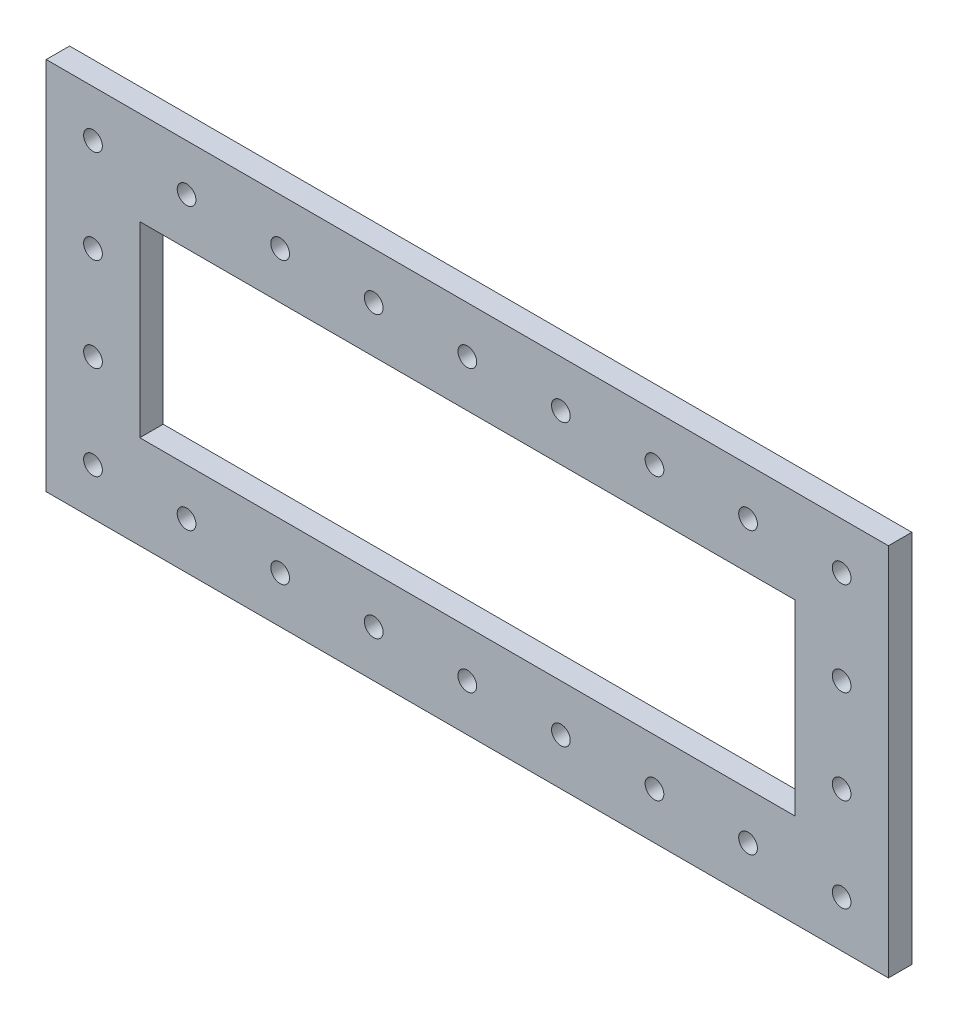
ISO-10303-21;
HEADER;
FILE_DESCRIPTION(('STEP AP214'),'2;1');
FILE_NAME('part.step','',(''),(''),'','','');
FILE_SCHEMA(('AUTOMOTIVE_DESIGN { 1 0 10303 214 1 1 1 1 }'));
ENDSEC;
DATA;
#1=APPLICATION_CONTEXT('core data for automotive mechanical design processes');
#2=APPLICATION_PROTOCOL_DEFINITION('international standard','automotive_design',2000,#1);
#3=PRODUCT_CONTEXT('',#1,'mechanical');
#4=PRODUCT('Part','Part','',(#3));
#5=PRODUCT_RELATED_PRODUCT_CATEGORY('part','',(#4));
#6=PRODUCT_DEFINITION_FORMATION('','',#4);
#7=PRODUCT_DEFINITION_CONTEXT('part definition',#1,'design');
#8=PRODUCT_DEFINITION('design','',#6,#7);
#9=PRODUCT_DEFINITION_SHAPE('','',#8);
#10=(LENGTH_UNIT() NAMED_UNIT(*) SI_UNIT(.MILLI.,.METRE.));
#11=(NAMED_UNIT(*) PLANE_ANGLE_UNIT() SI_UNIT($,.RADIAN.));
#12=(NAMED_UNIT(*) SI_UNIT($,.STERADIAN.) SOLID_ANGLE_UNIT());
#13=UNCERTAINTY_MEASURE_WITH_UNIT(LENGTH_MEASURE(1.E-05),#10,'distance_accuracy_value','');
#14=(GEOMETRIC_REPRESENTATION_CONTEXT(3) GLOBAL_UNCERTAINTY_ASSIGNED_CONTEXT((#13)) GLOBAL_UNIT_ASSIGNED_CONTEXT((#10,
#11,#12)) REPRESENTATION_CONTEXT('',''));
#15=CARTESIAN_POINT('',(0.,0.,0.));
#16=DIRECTION('',(0.,0.,1.));
#17=DIRECTION('',(1.,0.,0.));
#18=AXIS2_PLACEMENT_3D('',#15,#16,#17);
#19=CARTESIAN_POINT('',(228.6,0.,6.35));
#20=DIRECTION('',(0.,1.,0.));
#21=DIRECTION('',(-1.,0.,0.));
#22=AXIS2_PLACEMENT_3D('',#19,#20,#21);
#23=PLANE('',#22);
#24=DIRECTION('',(1.,0.,0.));
#25=VECTOR('',#24,1.);
#26=CARTESIAN_POINT('',(228.6,0.,0.));
#27=LINE('',#26,#25);
#28=CARTESIAN_POINT('',(0.,0.,0.));
#29=VERTEX_POINT('',#28);
#30=CARTESIAN_POINT('',(228.6,0.,0.));
#31=VERTEX_POINT('',#30);
#32=EDGE_CURVE('E210',#29,#31,#27,.T.);
#33=ORIENTED_EDGE('',*,*,#32,.T.);
#34=DIRECTION('',(0.,0.,-1.));
#35=VECTOR('',#34,1.);
#36=CARTESIAN_POINT('',(228.6,0.,6.35));
#37=LINE('',#36,#35);
#38=CARTESIAN_POINT('',(228.6,0.,6.35));
#39=VERTEX_POINT('',#38);
#40=EDGE_CURVE('E11',#39,#31,#37,.T.);
#41=ORIENTED_EDGE('',*,*,#40,.F.);
#42=DIRECTION('',(1.,0.,0.));
#43=VECTOR('',#42,1.);
#44=CARTESIAN_POINT('',(228.6,0.,6.35));
#45=LINE('',#44,#43);
#46=CARTESIAN_POINT('',(0.,0.,6.35));
#47=VERTEX_POINT('',#46);
#48=EDGE_CURVE('E213',#47,#39,#45,.T.);
#49=ORIENTED_EDGE('',*,*,#48,.F.);
#50=DIRECTION('',(0.,0.,-1.));
#51=VECTOR('',#50,1.);
#52=CARTESIAN_POINT('',(0.,0.,6.35));
#53=LINE('',#52,#51);
#54=EDGE_CURVE('E111',#47,#29,#53,.T.);
#55=ORIENTED_EDGE('',*,*,#54,.T.);
#56=EDGE_LOOP('',(#33,#41,#49,#55));
#57=FACE_BOUND('',#56,.T.);
#58=ADVANCED_FACE('F36',(#57),#23,.F.);
#59=CARTESIAN_POINT('',(228.6,50.8,6.35));
#60=DIRECTION('',(-1.,0.,0.));
#61=DIRECTION('',(0.,0.,1.));
#62=AXIS2_PLACEMENT_3D('',#59,#60,#61);
#63=PLANE('',#62);
#64=DIRECTION('',(0.,1.,0.));
#65=VECTOR('',#64,1.);
#66=CARTESIAN_POINT('',(228.6,50.8,0.));
#67=LINE('',#66,#65);
#68=CARTESIAN_POINT('',(228.6,101.6,0.));
#69=VERTEX_POINT('',#68);
#70=EDGE_CURVE('E223',#31,#69,#67,.T.);
#71=ORIENTED_EDGE('',*,*,#70,.T.);
#72=DIRECTION('',(0.,0.,-1.));
#73=VECTOR('',#72,1.);
#74=CARTESIAN_POINT('',(228.6,101.6,6.35));
#75=LINE('',#74,#73);
#76=CARTESIAN_POINT('',(228.6,101.6,6.35));
#77=VERTEX_POINT('',#76);
#78=EDGE_CURVE('E131',#77,#69,#75,.T.);
#79=ORIENTED_EDGE('',*,*,#78,.F.);
#80=DIRECTION('',(0.,1.,0.));
#81=VECTOR('',#80,1.);
#82=CARTESIAN_POINT('',(228.6,50.8,6.35));
#83=LINE('',#82,#81);
#84=EDGE_CURVE('E85',#39,#77,#83,.T.);
#85=ORIENTED_EDGE('',*,*,#84,.F.);
#86=ORIENTED_EDGE('',*,*,#40,.T.);
#87=EDGE_LOOP('',(#71,#79,#85,#86));
#88=FACE_BOUND('',#87,.T.);
#89=ADVANCED_FACE('F252',(#88),#63,.F.);
#90=CARTESIAN_POINT('',(203.2,25.4,6.35));
#91=DIRECTION('',(1.,0.,0.));
#92=DIRECTION('',(0.,0.,-1.));
#93=AXIS2_PLACEMENT_3D('',#90,#91,#92);
#94=PLANE('',#93);
#95=DIRECTION('',(0.,-1.,0.));
#96=VECTOR('',#95,1.);
#97=CARTESIAN_POINT('',(203.2,25.4,0.));
#98=LINE('',#97,#96);
#99=CARTESIAN_POINT('',(203.2,76.2,0.));
#100=VERTEX_POINT('',#99);
#101=CARTESIAN_POINT('',(203.2,25.4,0.));
#102=VERTEX_POINT('',#101);
#103=EDGE_CURVE('E225',#100,#102,#98,.T.);
#104=ORIENTED_EDGE('',*,*,#103,.T.);
#105=DIRECTION('',(0.,0.,-1.));
#106=VECTOR('',#105,1.);
#107=CARTESIAN_POINT('',(203.2,25.4,6.35));
#108=LINE('',#107,#106);
#109=CARTESIAN_POINT('',(203.2,25.4,6.35));
#110=VERTEX_POINT('',#109);
#111=EDGE_CURVE('E44',#110,#102,#108,.T.);
#112=ORIENTED_EDGE('',*,*,#111,.F.);
#113=DIRECTION('',(0.,-1.,0.));
#114=VECTOR('',#113,1.);
#115=CARTESIAN_POINT('',(203.2,25.4,6.35));
#116=LINE('',#115,#114);
#117=CARTESIAN_POINT('',(203.2,76.2,6.35));
#118=VERTEX_POINT('',#117);
#119=EDGE_CURVE('E216',#118,#110,#116,.T.);
#120=ORIENTED_EDGE('',*,*,#119,.F.);
#121=DIRECTION('',(0.,0.,-1.));
#122=VECTOR('',#121,1.);
#123=CARTESIAN_POINT('',(203.2,76.2,6.35));
#124=LINE('',#123,#122);
#125=EDGE_CURVE('E142',#118,#100,#124,.T.);
#126=ORIENTED_EDGE('',*,*,#125,.T.);
#127=EDGE_LOOP('',(#104,#112,#120,#126));
#128=FACE_BOUND('',#127,.T.);
#129=ADVANCED_FACE('F250',(#128),#94,.F.);
#130=CARTESIAN_POINT('',(25.4,25.4,6.35));
#131=DIRECTION('',(0.,-1.,0.));
#132=DIRECTION('',(0.,0.,-1.));
#133=AXIS2_PLACEMENT_3D('',#130,#131,#132);
#134=PLANE('',#133);
#135=DIRECTION('',(-1.,0.,0.));
#136=VECTOR('',#135,1.);
#137=CARTESIAN_POINT('',(25.4,25.4,0.));
#138=LINE('',#137,#136);
#139=CARTESIAN_POINT('',(25.4,25.4,0.));
#140=VERTEX_POINT('',#139);
#141=EDGE_CURVE('E71',#102,#140,#138,.T.);
#142=ORIENTED_EDGE('',*,*,#141,.T.);
#143=DIRECTION('',(0.,0.,-1.));
#144=VECTOR('',#143,1.);
#145=CARTESIAN_POINT('',(25.4,25.4,6.35));
#146=LINE('',#145,#144);
#147=CARTESIAN_POINT('',(25.4,25.4,6.35));
#148=VERTEX_POINT('',#147);
#149=EDGE_CURVE('E232',#148,#140,#146,.T.);
#150=ORIENTED_EDGE('',*,*,#149,.F.);
#151=DIRECTION('',(-1.,0.,0.));
#152=VECTOR('',#151,1.);
#153=CARTESIAN_POINT('',(25.4,25.4,6.35));
#154=LINE('',#153,#152);
#155=EDGE_CURVE('E218',#110,#148,#154,.T.);
#156=ORIENTED_EDGE('',*,*,#155,.F.);
#157=ORIENTED_EDGE('',*,*,#111,.T.);
#158=EDGE_LOOP('',(#142,#150,#156,#157));
#159=FACE_BOUND('',#158,.T.);
#160=ADVANCED_FACE('F235',(#159),#134,.F.);
#161=CARTESIAN_POINT('',(25.4,50.8,6.35));
#162=DIRECTION('',(-1.,0.,0.));
#163=DIRECTION('',(0.,-1.,0.));
#164=AXIS2_PLACEMENT_3D('',#161,#162,#163);
#165=PLANE('',#164);
#166=DIRECTION('',(0.,1.,0.));
#167=VECTOR('',#166,1.);
#168=CARTESIAN_POINT('',(25.4,50.8,0.));
#169=LINE('',#168,#167);
#170=CARTESIAN_POINT('',(25.4,76.2,0.));
#171=VERTEX_POINT('',#170);
#172=EDGE_CURVE('E228',#140,#171,#169,.T.);
#173=ORIENTED_EDGE('',*,*,#172,.T.);
#174=DIRECTION('',(0.,0.,-1.));
#175=VECTOR('',#174,1.);
#176=CARTESIAN_POINT('',(25.4,76.2,6.35));
#177=LINE('',#176,#175);
#178=CARTESIAN_POINT('',(25.4,76.2,6.35));
#179=VERTEX_POINT('',#178);
#180=EDGE_CURVE('E123',#179,#171,#177,.T.);
#181=ORIENTED_EDGE('',*,*,#180,.F.);
#182=DIRECTION('',(0.,1.,0.));
#183=VECTOR('',#182,1.);
#184=CARTESIAN_POINT('',(25.4,50.8,6.35));
#185=LINE('',#184,#183);
#186=EDGE_CURVE('E113',#148,#179,#185,.T.);
#187=ORIENTED_EDGE('',*,*,#186,.F.);
#188=ORIENTED_EDGE('',*,*,#149,.T.);
#189=EDGE_LOOP('',(#173,#181,#187,#188));
#190=FACE_BOUND('',#189,.T.);
#191=ADVANCED_FACE('F243',(#190),#165,.F.);
#192=CARTESIAN_POINT('',(0.,0.,6.35));
#193=DIRECTION('',(1.,0.,0.));
#194=DIRECTION('',(0.,0.,-1.));
#195=AXIS2_PLACEMENT_3D('',#192,#193,#194);
#196=PLANE('',#195);
#197=DIRECTION('',(0.,-1.,0.));
#198=VECTOR('',#197,1.);
#199=CARTESIAN_POINT('',(0.,0.,0.));
#200=LINE('',#199,#198);
#201=CARTESIAN_POINT('',(0.,101.6,0.));
#202=VERTEX_POINT('',#201);
#203=EDGE_CURVE('E78',#202,#29,#200,.T.);
#204=ORIENTED_EDGE('',*,*,#203,.T.);
#205=ORIENTED_EDGE('',*,*,#54,.F.);
#206=DIRECTION('',(0.,-1.,0.));
#207=VECTOR('',#206,1.);
#208=CARTESIAN_POINT('',(0.,0.,6.35));
#209=LINE('',#208,#207);
#210=CARTESIAN_POINT('',(0.,101.6,6.35));
#211=VERTEX_POINT('',#210);
#212=EDGE_CURVE('E52',#211,#47,#209,.T.);
#213=ORIENTED_EDGE('',*,*,#212,.F.);
#214=DIRECTION('',(0.,0.,-1.));
#215=VECTOR('',#214,1.);
#216=CARTESIAN_POINT('',(0.,101.6,6.35));
#217=LINE('',#216,#215);
#218=EDGE_CURVE('E109',#211,#202,#217,.T.);
#219=ORIENTED_EDGE('',*,*,#218,.T.);
#220=EDGE_LOOP('',(#204,#205,#213,#219));
#221=FACE_BOUND('',#220,.T.);
#222=ADVANCED_FACE('F108',(#221),#196,.F.);
#223=CARTESIAN_POINT('',(0.,0.,6.35));
#224=DIRECTION('',(0.,0.,-1.));
#225=DIRECTION('',(-1.,0.,0.));
#226=AXIS2_PLACEMENT_3D('',#223,#224,#225);
#227=PLANE('',#226);
#228=CARTESIAN_POINT('',(215.9,63.5000000000001,6.35));
#229=DIRECTION('',(0.,0.,-1.));
#230=DIRECTION('',(-1.,0.,0.));
#231=AXIS2_PLACEMENT_3D('',#228,#229,#230);
#232=CIRCLE('',#231,2.53999999999996);
#233=CARTESIAN_POINT('',(213.36,63.5000000000001,6.35));
#234=VERTEX_POINT('',#233);
#235=EDGE_CURVE('E635',#234,#234,#232,.T.);
#236=ORIENTED_EDGE('',*,*,#235,.T.);
#237=EDGE_LOOP('',(#236));
#238=FACE_BOUND('',#237,.T.);
#239=CARTESIAN_POINT('',(215.9,88.9,6.35));
#240=DIRECTION('',(0.,0.,-1.));
#241=DIRECTION('',(1.,0.,0.));
#242=AXIS2_PLACEMENT_3D('',#239,#240,#241);
#243=CIRCLE('',#242,2.54000000000001);
#244=CARTESIAN_POINT('',(218.44,88.9,6.35));
#245=VERTEX_POINT('',#244);
#246=EDGE_CURVE('E637',#245,#245,#243,.T.);
#247=ORIENTED_EDGE('',*,*,#246,.T.);
#248=EDGE_LOOP('',(#247));
#249=FACE_BOUND('',#248,.T.);
#250=CARTESIAN_POINT('',(190.5,88.9,6.35));
#251=DIRECTION('',(0.,0.,-1.));
#252=DIRECTION('',(1.,0.,0.));
#253=AXIS2_PLACEMENT_3D('',#250,#251,#252);
#254=CIRCLE('',#253,2.53999999999998);
#255=CARTESIAN_POINT('',(193.04,88.9,6.35));
#256=VERTEX_POINT('',#255);
#257=EDGE_CURVE('E692',#256,#256,#254,.T.);
#258=ORIENTED_EDGE('',*,*,#257,.T.);
#259=EDGE_LOOP('',(#258));
#260=FACE_BOUND('',#259,.T.);
#261=CARTESIAN_POINT('',(165.1,88.9,6.35));
#262=DIRECTION('',(0.,0.,-1.));
#263=DIRECTION('',(1.,0.,0.));
#264=AXIS2_PLACEMENT_3D('',#261,#262,#263);
#265=CIRCLE('',#264,2.54000000000001);
#266=CARTESIAN_POINT('',(167.64,88.9,6.35));
#267=VERTEX_POINT('',#266);
#268=EDGE_CURVE('E686',#267,#267,#265,.T.);
#269=ORIENTED_EDGE('',*,*,#268,.T.);
#270=EDGE_LOOP('',(#269));
#271=FACE_BOUND('',#270,.T.);
#272=CARTESIAN_POINT('',(139.7,88.9,6.35));
#273=DIRECTION('',(0.,0.,-1.));
#274=DIRECTION('',(1.,0.,0.));
#275=AXIS2_PLACEMENT_3D('',#272,#273,#274);
#276=CIRCLE('',#275,2.54000000000001);
#277=CARTESIAN_POINT('',(142.24,88.9,6.35));
#278=VERTEX_POINT('',#277);
#279=EDGE_CURVE('E680',#278,#278,#276,.T.);
#280=ORIENTED_EDGE('',*,*,#279,.T.);
#281=EDGE_LOOP('',(#280));
#282=FACE_BOUND('',#281,.T.);
#283=CARTESIAN_POINT('',(114.3,88.9,6.35));
#284=DIRECTION('',(0.,0.,-1.));
#285=DIRECTION('',(1.,0.,0.));
#286=AXIS2_PLACEMENT_3D('',#283,#284,#285);
#287=CIRCLE('',#286,2.54);
#288=CARTESIAN_POINT('',(116.84,88.9,6.35));
#289=VERTEX_POINT('',#288);
#290=EDGE_CURVE('E674',#289,#289,#287,.T.);
#291=ORIENTED_EDGE('',*,*,#290,.T.);
#292=EDGE_LOOP('',(#291));
#293=FACE_BOUND('',#292,.T.);
#294=CARTESIAN_POINT('',(88.9,88.9,6.35));
#295=DIRECTION('',(0.,0.,-1.));
#296=DIRECTION('',(1.,0.,0.));
#297=AXIS2_PLACEMENT_3D('',#294,#295,#296);
#298=CIRCLE('',#297,2.54);
#299=CARTESIAN_POINT('',(91.44,88.9,6.35));
#300=VERTEX_POINT('',#299);
#301=EDGE_CURVE('E668',#300,#300,#298,.T.);
#302=ORIENTED_EDGE('',*,*,#301,.T.);
#303=EDGE_LOOP('',(#302));
#304=FACE_BOUND('',#303,.T.);
#305=CARTESIAN_POINT('',(63.5,88.9,6.35));
#306=DIRECTION('',(0.,0.,-1.));
#307=DIRECTION('',(1.,0.,0.));
#308=AXIS2_PLACEMENT_3D('',#305,#306,#307);
#309=CIRCLE('',#308,2.54);
#310=CARTESIAN_POINT('',(66.04,88.9,6.35));
#311=VERTEX_POINT('',#310);
#312=EDGE_CURVE('E662',#311,#311,#309,.T.);
#313=ORIENTED_EDGE('',*,*,#312,.T.);
#314=EDGE_LOOP('',(#313));
#315=FACE_BOUND('',#314,.T.);
#316=CARTESIAN_POINT('',(38.1,88.9,6.35));
#317=DIRECTION('',(0.,0.,-1.));
#318=DIRECTION('',(1.,0.,0.));
#319=AXIS2_PLACEMENT_3D('',#316,#317,#318);
#320=CIRCLE('',#319,2.54);
#321=CARTESIAN_POINT('',(40.64,88.9,6.35));
#322=VERTEX_POINT('',#321);
#323=EDGE_CURVE('E656',#322,#322,#320,.T.);
#324=ORIENTED_EDGE('',*,*,#323,.T.);
#325=EDGE_LOOP('',(#324));
#326=FACE_BOUND('',#325,.T.);
#327=CARTESIAN_POINT('',(12.7,88.9,6.35));
#328=DIRECTION('',(0.,0.,-1.));
#329=DIRECTION('',(1.,0.,0.));
#330=AXIS2_PLACEMENT_3D('',#327,#328,#329);
#331=CIRCLE('',#330,2.54);
#332=CARTESIAN_POINT('',(15.24,88.9,6.35));
#333=VERTEX_POINT('',#332);
#334=EDGE_CURVE('E647',#333,#333,#331,.T.);
#335=ORIENTED_EDGE('',*,*,#334,.T.);
#336=EDGE_LOOP('',(#335));
#337=FACE_BOUND('',#336,.T.);
#338=CARTESIAN_POINT('',(12.7,63.5,6.35));
#339=DIRECTION('',(0.,0.,-1.));
#340=DIRECTION('',(1.,0.,0.));
#341=AXIS2_PLACEMENT_3D('',#338,#339,#340);
#342=CIRCLE('',#341,2.54);
#343=CARTESIAN_POINT('',(15.24,63.5,6.35));
#344=VERTEX_POINT('',#343);
#345=EDGE_CURVE('E136',#344,#344,#342,.T.);
#346=ORIENTED_EDGE('',*,*,#345,.T.);
#347=EDGE_LOOP('',(#346));
#348=FACE_BOUND('',#347,.T.);
#349=DIRECTION('',(1.,0.,0.));
#350=VECTOR('',#349,1.);
#351=CARTESIAN_POINT('',(228.6,101.6,6.35));
#352=LINE('',#351,#350);
#353=EDGE_CURVE('E119',#211,#77,#352,.T.);
#354=ORIENTED_EDGE('',*,*,#353,.F.);
#355=ORIENTED_EDGE('',*,*,#212,.T.);
#356=ORIENTED_EDGE('',*,*,#48,.T.);
#357=ORIENTED_EDGE('',*,*,#84,.T.);
#358=EDGE_LOOP('',(#354,#355,#356,#357));
#359=FACE_BOUND('',#358,.T.);
#360=CARTESIAN_POINT('',(215.9,38.0999999999999,6.35));
#361=DIRECTION('',(0.,0.,1.));
#362=DIRECTION('',(-1.,0.,0.));
#363=AXIS2_PLACEMENT_3D('',#360,#361,#362);
#364=CIRCLE('',#363,2.53999999999996);
#365=CARTESIAN_POINT('',(213.36,38.0999999999999,6.35));
#366=VERTEX_POINT('',#365);
#367=EDGE_CURVE('E122',#366,#366,#364,.T.);
#368=ORIENTED_EDGE('',*,*,#367,.F.);
#369=EDGE_LOOP('',(#368));
#370=FACE_BOUND('',#369,.T.);
#371=CARTESIAN_POINT('',(215.9,12.7,6.35));
#372=DIRECTION('',(0.,0.,1.));
#373=DIRECTION('',(1.,0.,0.));
#374=AXIS2_PLACEMENT_3D('',#371,#372,#373);
#375=CIRCLE('',#374,2.54000000000001);
#376=CARTESIAN_POINT('',(218.44,12.7,6.35));
#377=VERTEX_POINT('',#376);
#378=EDGE_CURVE('E199',#377,#377,#375,.T.);
#379=ORIENTED_EDGE('',*,*,#378,.F.);
#380=EDGE_LOOP('',(#379));
#381=FACE_BOUND('',#380,.T.);
#382=CARTESIAN_POINT('',(190.5,12.7,6.35));
#383=DIRECTION('',(0.,0.,1.));
#384=DIRECTION('',(1.,0.,0.));
#385=AXIS2_PLACEMENT_3D('',#382,#383,#384);
#386=CIRCLE('',#385,2.53999999999998);
#387=CARTESIAN_POINT('',(193.04,12.7,6.35));
#388=VERTEX_POINT('',#387);
#389=EDGE_CURVE('E193',#388,#388,#386,.T.);
#390=ORIENTED_EDGE('',*,*,#389,.F.);
#391=EDGE_LOOP('',(#390));
#392=FACE_BOUND('',#391,.T.);
#393=CARTESIAN_POINT('',(165.1,12.7,6.35));
#394=DIRECTION('',(0.,0.,1.));
#395=DIRECTION('',(1.,0.,0.));
#396=AXIS2_PLACEMENT_3D('',#393,#394,#395);
#397=CIRCLE('',#396,2.54000000000001);
#398=CARTESIAN_POINT('',(167.64,12.7,6.35));
#399=VERTEX_POINT('',#398);
#400=EDGE_CURVE('E187',#399,#399,#397,.T.);
#401=ORIENTED_EDGE('',*,*,#400,.F.);
#402=EDGE_LOOP('',(#401));
#403=FACE_BOUND('',#402,.T.);
#404=CARTESIAN_POINT('',(139.7,12.7,6.35));
#405=DIRECTION('',(0.,0.,1.));
#406=DIRECTION('',(1.,0.,0.));
#407=AXIS2_PLACEMENT_3D('',#404,#405,#406);
#408=CIRCLE('',#407,2.54000000000001);
#409=CARTESIAN_POINT('',(142.24,12.7,6.35));
#410=VERTEX_POINT('',#409);
#411=EDGE_CURVE('E181',#410,#410,#408,.T.);
#412=ORIENTED_EDGE('',*,*,#411,.F.);
#413=EDGE_LOOP('',(#412));
#414=FACE_BOUND('',#413,.T.);
#415=CARTESIAN_POINT('',(114.3,12.7,6.35));
#416=DIRECTION('',(0.,0.,1.));
#417=DIRECTION('',(1.,0.,0.));
#418=AXIS2_PLACEMENT_3D('',#415,#416,#417);
#419=CIRCLE('',#418,2.54);
#420=CARTESIAN_POINT('',(116.84,12.7,6.35));
#421=VERTEX_POINT('',#420);
#422=EDGE_CURVE('E175',#421,#421,#419,.T.);
#423=ORIENTED_EDGE('',*,*,#422,.F.);
#424=EDGE_LOOP('',(#423));
#425=FACE_BOUND('',#424,.T.);
#426=CARTESIAN_POINT('',(88.9,12.7,6.35));
#427=DIRECTION('',(0.,0.,1.));
#428=DIRECTION('',(1.,0.,0.));
#429=AXIS2_PLACEMENT_3D('',#426,#427,#428);
#430=CIRCLE('',#429,2.54);
#431=CARTESIAN_POINT('',(91.44,12.7,6.35));
#432=VERTEX_POINT('',#431);
#433=EDGE_CURVE('E169',#432,#432,#430,.T.);
#434=ORIENTED_EDGE('',*,*,#433,.F.);
#435=EDGE_LOOP('',(#434));
#436=FACE_BOUND('',#435,.T.);
#437=CARTESIAN_POINT('',(63.5,12.7,6.35));
#438=DIRECTION('',(0.,0.,1.));
#439=DIRECTION('',(1.,0.,0.));
#440=AXIS2_PLACEMENT_3D('',#437,#438,#439);
#441=CIRCLE('',#440,2.54);
#442=CARTESIAN_POINT('',(66.04,12.7,6.35));
#443=VERTEX_POINT('',#442);
#444=EDGE_CURVE('E163',#443,#443,#441,.T.);
#445=ORIENTED_EDGE('',*,*,#444,.F.);
#446=EDGE_LOOP('',(#445));
#447=FACE_BOUND('',#446,.T.);
#448=CARTESIAN_POINT('',(38.1,12.7,6.35));
#449=DIRECTION('',(0.,0.,1.));
#450=DIRECTION('',(1.,0.,0.));
#451=AXIS2_PLACEMENT_3D('',#448,#449,#450);
#452=CIRCLE('',#451,2.54);
#453=CARTESIAN_POINT('',(40.64,12.7,6.35));
#454=VERTEX_POINT('',#453);
#455=EDGE_CURVE('E157',#454,#454,#452,.T.);
#456=ORIENTED_EDGE('',*,*,#455,.F.);
#457=EDGE_LOOP('',(#456));
#458=FACE_BOUND('',#457,.T.);
#459=CARTESIAN_POINT('',(12.7,12.7,6.35));
#460=DIRECTION('',(0.,0.,1.));
#461=DIRECTION('',(1.,0.,0.));
#462=AXIS2_PLACEMENT_3D('',#459,#460,#461);
#463=CIRCLE('',#462,2.54);
#464=CARTESIAN_POINT('',(15.24,12.7,6.35));
#465=VERTEX_POINT('',#464);
#466=EDGE_CURVE('E151',#465,#465,#463,.T.);
#467=ORIENTED_EDGE('',*,*,#466,.F.);
#468=EDGE_LOOP('',(#467));
#469=FACE_BOUND('',#468,.T.);
#470=CARTESIAN_POINT('',(12.7,38.1,6.35));
#471=DIRECTION('',(0.,0.,1.));
#472=DIRECTION('',(1.,0.,0.));
#473=AXIS2_PLACEMENT_3D('',#470,#471,#472);
#474=CIRCLE('',#473,2.54);
#475=CARTESIAN_POINT('',(15.24,38.1,6.35));
#476=VERTEX_POINT('',#475);
#477=EDGE_CURVE('E150',#476,#476,#474,.T.);
#478=ORIENTED_EDGE('',*,*,#477,.F.);
#479=EDGE_LOOP('',(#478));
#480=FACE_BOUND('',#479,.T.);
#481=ORIENTED_EDGE('',*,*,#186,.T.);
#482=DIRECTION('',(-1.,0.,0.));
#483=VECTOR('',#482,1.);
#484=CARTESIAN_POINT('',(25.4,76.2,6.35));
#485=LINE('',#484,#483);
#486=EDGE_CURVE('E127',#118,#179,#485,.T.);
#487=ORIENTED_EDGE('',*,*,#486,.F.);
#488=ORIENTED_EDGE('',*,*,#119,.T.);
#489=ORIENTED_EDGE('',*,*,#155,.T.);
#490=EDGE_LOOP('',(#481,#487,#488,#489));
#491=FACE_BOUND('',#490,.T.);
#492=ADVANCED_FACE('F125',(#238,#249,#260,#271,#282,#293,#304,#315,#326,#337,#348,#359,#370,
#381,#392,#403,#414,#425,#436,#447,#458,#469,#480,#491),#227,.F.);
#493=CARTESIAN_POINT('',(0.,0.,0.));
#494=DIRECTION('',(0.,0.,-1.));
#495=DIRECTION('',(-1.,0.,0.));
#496=AXIS2_PLACEMENT_3D('',#493,#494,#495);
#497=PLANE('',#496);
#498=CARTESIAN_POINT('',(215.9,63.5000000000001,0.));
#499=DIRECTION('',(0.,0.,-1.));
#500=DIRECTION('',(-1.,0.,0.));
#501=AXIS2_PLACEMENT_3D('',#498,#499,#500);
#502=CIRCLE('',#501,2.53999999999996);
#503=CARTESIAN_POINT('',(213.36,63.5000000000001,0.));
#504=VERTEX_POINT('',#503);
#505=EDGE_CURVE('E633',#504,#504,#502,.T.);
#506=ORIENTED_EDGE('',*,*,#505,.F.);
#507=EDGE_LOOP('',(#506));
#508=FACE_BOUND('',#507,.T.);
#509=CARTESIAN_POINT('',(215.9,88.9,0.));
#510=DIRECTION('',(0.,0.,-1.));
#511=DIRECTION('',(1.,0.,0.));
#512=AXIS2_PLACEMENT_3D('',#509,#510,#511);
#513=CIRCLE('',#512,2.54000000000001);
#514=CARTESIAN_POINT('',(218.44,88.9,0.));
#515=VERTEX_POINT('',#514);
#516=EDGE_CURVE('E695',#515,#515,#513,.T.);
#517=ORIENTED_EDGE('',*,*,#516,.F.);
#518=EDGE_LOOP('',(#517));
#519=FACE_BOUND('',#518,.T.);
#520=CARTESIAN_POINT('',(190.5,88.9,0.));
#521=DIRECTION('',(0.,0.,-1.));
#522=DIRECTION('',(1.,0.,0.));
#523=AXIS2_PLACEMENT_3D('',#520,#521,#522);
#524=CIRCLE('',#523,2.53999999999998);
#525=CARTESIAN_POINT('',(193.04,88.9,0.));
#526=VERTEX_POINT('',#525);
#527=EDGE_CURVE('E689',#526,#526,#524,.T.);
#528=ORIENTED_EDGE('',*,*,#527,.F.);
#529=EDGE_LOOP('',(#528));
#530=FACE_BOUND('',#529,.T.);
#531=CARTESIAN_POINT('',(165.1,88.9,0.));
#532=DIRECTION('',(0.,0.,-1.));
#533=DIRECTION('',(1.,0.,0.));
#534=AXIS2_PLACEMENT_3D('',#531,#532,#533);
#535=CIRCLE('',#534,2.54000000000001);
#536=CARTESIAN_POINT('',(167.64,88.9,0.));
#537=VERTEX_POINT('',#536);
#538=EDGE_CURVE('E683',#537,#537,#535,.T.);
#539=ORIENTED_EDGE('',*,*,#538,.F.);
#540=EDGE_LOOP('',(#539));
#541=FACE_BOUND('',#540,.T.);
#542=CARTESIAN_POINT('',(139.7,88.9,0.));
#543=DIRECTION('',(0.,0.,-1.));
#544=DIRECTION('',(1.,0.,0.));
#545=AXIS2_PLACEMENT_3D('',#542,#543,#544);
#546=CIRCLE('',#545,2.54000000000001);
#547=CARTESIAN_POINT('',(142.24,88.9,0.));
#548=VERTEX_POINT('',#547);
#549=EDGE_CURVE('E677',#548,#548,#546,.T.);
#550=ORIENTED_EDGE('',*,*,#549,.F.);
#551=EDGE_LOOP('',(#550));
#552=FACE_BOUND('',#551,.T.);
#553=CARTESIAN_POINT('',(114.3,88.9,0.));
#554=DIRECTION('',(0.,0.,-1.));
#555=DIRECTION('',(1.,0.,0.));
#556=AXIS2_PLACEMENT_3D('',#553,#554,#555);
#557=CIRCLE('',#556,2.54);
#558=CARTESIAN_POINT('',(116.84,88.9,0.));
#559=VERTEX_POINT('',#558);
#560=EDGE_CURVE('E671',#559,#559,#557,.T.);
#561=ORIENTED_EDGE('',*,*,#560,.F.);
#562=EDGE_LOOP('',(#561));
#563=FACE_BOUND('',#562,.T.);
#564=CARTESIAN_POINT('',(88.9,88.9,0.));
#565=DIRECTION('',(0.,0.,-1.));
#566=DIRECTION('',(1.,0.,0.));
#567=AXIS2_PLACEMENT_3D('',#564,#565,#566);
#568=CIRCLE('',#567,2.54);
#569=CARTESIAN_POINT('',(91.44,88.9,0.));
#570=VERTEX_POINT('',#569);
#571=EDGE_CURVE('E665',#570,#570,#568,.T.);
#572=ORIENTED_EDGE('',*,*,#571,.F.);
#573=EDGE_LOOP('',(#572));
#574=FACE_BOUND('',#573,.T.);
#575=CARTESIAN_POINT('',(63.5,88.9,0.));
#576=DIRECTION('',(0.,0.,-1.));
#577=DIRECTION('',(1.,0.,0.));
#578=AXIS2_PLACEMENT_3D('',#575,#576,#577);
#579=CIRCLE('',#578,2.54);
#580=CARTESIAN_POINT('',(66.04,88.9,0.));
#581=VERTEX_POINT('',#580);
#582=EDGE_CURVE('E659',#581,#581,#579,.T.);
#583=ORIENTED_EDGE('',*,*,#582,.F.);
#584=EDGE_LOOP('',(#583));
#585=FACE_BOUND('',#584,.T.);
#586=CARTESIAN_POINT('',(38.1,88.9,0.));
#587=DIRECTION('',(0.,0.,-1.));
#588=DIRECTION('',(1.,0.,0.));
#589=AXIS2_PLACEMENT_3D('',#586,#587,#588);
#590=CIRCLE('',#589,2.54);
#591=CARTESIAN_POINT('',(40.64,88.9,0.));
#592=VERTEX_POINT('',#591);
#593=EDGE_CURVE('E651',#592,#592,#590,.T.);
#594=ORIENTED_EDGE('',*,*,#593,.F.);
#595=EDGE_LOOP('',(#594));
#596=FACE_BOUND('',#595,.T.);
#597=CARTESIAN_POINT('',(12.7,88.9,0.));
#598=DIRECTION('',(0.,0.,-1.));
#599=DIRECTION('',(1.,0.,0.));
#600=AXIS2_PLACEMENT_3D('',#597,#598,#599);
#601=CIRCLE('',#600,2.54);
#602=CARTESIAN_POINT('',(15.24,88.9,0.));
#603=VERTEX_POINT('',#602);
#604=EDGE_CURVE('E643',#603,#603,#601,.T.);
#605=ORIENTED_EDGE('',*,*,#604,.F.);
#606=EDGE_LOOP('',(#605));
#607=FACE_BOUND('',#606,.T.);
#608=CARTESIAN_POINT('',(12.7,63.5,0.));
#609=DIRECTION('',(0.,0.,-1.));
#610=DIRECTION('',(1.,0.,0.));
#611=AXIS2_PLACEMENT_3D('',#608,#609,#610);
#612=CIRCLE('',#611,2.54);
#613=CARTESIAN_POINT('',(15.24,63.5,0.));
#614=VERTEX_POINT('',#613);
#615=EDGE_CURVE('E139',#614,#614,#612,.T.);
#616=ORIENTED_EDGE('',*,*,#615,.F.);
#617=EDGE_LOOP('',(#616));
#618=FACE_BOUND('',#617,.T.);
#619=ORIENTED_EDGE('',*,*,#203,.F.);
#620=DIRECTION('',(1.,0.,0.));
#621=VECTOR('',#620,1.);
#622=CARTESIAN_POINT('',(228.6,101.6,0.));
#623=LINE('',#622,#621);
#624=EDGE_CURVE('E121',#202,#69,#623,.T.);
#625=ORIENTED_EDGE('',*,*,#624,.T.);
#626=ORIENTED_EDGE('',*,*,#70,.F.);
#627=ORIENTED_EDGE('',*,*,#32,.F.);
#628=EDGE_LOOP('',(#619,#625,#626,#627));
#629=FACE_BOUND('',#628,.T.);
#630=CARTESIAN_POINT('',(215.9,38.0999999999999,0.));
#631=DIRECTION('',(0.,0.,1.));
#632=DIRECTION('',(-1.,0.,0.));
#633=AXIS2_PLACEMENT_3D('',#630,#631,#632);
#634=CIRCLE('',#633,2.53999999999996);
#635=CARTESIAN_POINT('',(213.36,38.0999999999999,0.));
#636=VERTEX_POINT('',#635);
#637=EDGE_CURVE('E202',#636,#636,#634,.T.);
#638=ORIENTED_EDGE('',*,*,#637,.T.);
#639=EDGE_LOOP('',(#638));
#640=FACE_BOUND('',#639,.T.);
#641=CARTESIAN_POINT('',(215.9,12.7,0.));
#642=DIRECTION('',(0.,0.,1.));
#643=DIRECTION('',(1.,0.,0.));
#644=AXIS2_PLACEMENT_3D('',#641,#642,#643);
#645=CIRCLE('',#644,2.54000000000001);
#646=CARTESIAN_POINT('',(218.44,12.7,0.));
#647=VERTEX_POINT('',#646);
#648=EDGE_CURVE('E196',#647,#647,#645,.T.);
#649=ORIENTED_EDGE('',*,*,#648,.T.);
#650=EDGE_LOOP('',(#649));
#651=FACE_BOUND('',#650,.T.);
#652=CARTESIAN_POINT('',(190.5,12.7,0.));
#653=DIRECTION('',(0.,0.,1.));
#654=DIRECTION('',(1.,0.,0.));
#655=AXIS2_PLACEMENT_3D('',#652,#653,#654);
#656=CIRCLE('',#655,2.53999999999998);
#657=CARTESIAN_POINT('',(193.04,12.7,0.));
#658=VERTEX_POINT('',#657);
#659=EDGE_CURVE('E190',#658,#658,#656,.T.);
#660=ORIENTED_EDGE('',*,*,#659,.T.);
#661=EDGE_LOOP('',(#660));
#662=FACE_BOUND('',#661,.T.);
#663=CARTESIAN_POINT('',(165.1,12.7,0.));
#664=DIRECTION('',(0.,0.,1.));
#665=DIRECTION('',(1.,0.,0.));
#666=AXIS2_PLACEMENT_3D('',#663,#664,#665);
#667=CIRCLE('',#666,2.54000000000001);
#668=CARTESIAN_POINT('',(167.64,12.7,0.));
#669=VERTEX_POINT('',#668);
#670=EDGE_CURVE('E184',#669,#669,#667,.T.);
#671=ORIENTED_EDGE('',*,*,#670,.T.);
#672=EDGE_LOOP('',(#671));
#673=FACE_BOUND('',#672,.T.);
#674=CARTESIAN_POINT('',(139.7,12.7,0.));
#675=DIRECTION('',(0.,0.,1.));
#676=DIRECTION('',(1.,0.,0.));
#677=AXIS2_PLACEMENT_3D('',#674,#675,#676);
#678=CIRCLE('',#677,2.54000000000001);
#679=CARTESIAN_POINT('',(142.24,12.7,0.));
#680=VERTEX_POINT('',#679);
#681=EDGE_CURVE('E178',#680,#680,#678,.T.);
#682=ORIENTED_EDGE('',*,*,#681,.T.);
#683=EDGE_LOOP('',(#682));
#684=FACE_BOUND('',#683,.T.);
#685=CARTESIAN_POINT('',(114.3,12.7,0.));
#686=DIRECTION('',(0.,0.,1.));
#687=DIRECTION('',(1.,0.,0.));
#688=AXIS2_PLACEMENT_3D('',#685,#686,#687);
#689=CIRCLE('',#688,2.54);
#690=CARTESIAN_POINT('',(116.84,12.7,0.));
#691=VERTEX_POINT('',#690);
#692=EDGE_CURVE('E172',#691,#691,#689,.T.);
#693=ORIENTED_EDGE('',*,*,#692,.T.);
#694=EDGE_LOOP('',(#693));
#695=FACE_BOUND('',#694,.T.);
#696=CARTESIAN_POINT('',(88.9,12.7,0.));
#697=DIRECTION('',(0.,0.,1.));
#698=DIRECTION('',(1.,0.,0.));
#699=AXIS2_PLACEMENT_3D('',#696,#697,#698);
#700=CIRCLE('',#699,2.54);
#701=CARTESIAN_POINT('',(91.44,12.7,0.));
#702=VERTEX_POINT('',#701);
#703=EDGE_CURVE('E166',#702,#702,#700,.T.);
#704=ORIENTED_EDGE('',*,*,#703,.T.);
#705=EDGE_LOOP('',(#704));
#706=FACE_BOUND('',#705,.T.);
#707=CARTESIAN_POINT('',(63.5,12.7,0.));
#708=DIRECTION('',(0.,0.,1.));
#709=DIRECTION('',(1.,0.,0.));
#710=AXIS2_PLACEMENT_3D('',#707,#708,#709);
#711=CIRCLE('',#710,2.54);
#712=CARTESIAN_POINT('',(66.04,12.7,0.));
#713=VERTEX_POINT('',#712);
#714=EDGE_CURVE('E160',#713,#713,#711,.T.);
#715=ORIENTED_EDGE('',*,*,#714,.T.);
#716=EDGE_LOOP('',(#715));
#717=FACE_BOUND('',#716,.T.);
#718=CARTESIAN_POINT('',(38.1,12.7,0.));
#719=DIRECTION('',(0.,0.,1.));
#720=DIRECTION('',(1.,0.,0.));
#721=AXIS2_PLACEMENT_3D('',#718,#719,#720);
#722=CIRCLE('',#721,2.54);
#723=CARTESIAN_POINT('',(40.64,12.7,0.));
#724=VERTEX_POINT('',#723);
#725=EDGE_CURVE('E154',#724,#724,#722,.T.);
#726=ORIENTED_EDGE('',*,*,#725,.T.);
#727=EDGE_LOOP('',(#726));
#728=FACE_BOUND('',#727,.T.);
#729=CARTESIAN_POINT('',(12.7,12.7,0.));
#730=DIRECTION('',(0.,0.,1.));
#731=DIRECTION('',(1.,0.,0.));
#732=AXIS2_PLACEMENT_3D('',#729,#730,#731);
#733=CIRCLE('',#732,2.54);
#734=CARTESIAN_POINT('',(15.24,12.7,0.));
#735=VERTEX_POINT('',#734);
#736=EDGE_CURVE('E147',#735,#735,#733,.T.);
#737=ORIENTED_EDGE('',*,*,#736,.T.);
#738=EDGE_LOOP('',(#737));
#739=FACE_BOUND('',#738,.T.);
#740=CARTESIAN_POINT('',(12.7,38.1,0.));
#741=DIRECTION('',(0.,0.,1.));
#742=DIRECTION('',(1.,0.,0.));
#743=AXIS2_PLACEMENT_3D('',#740,#741,#742);
#744=CIRCLE('',#743,2.54);
#745=CARTESIAN_POINT('',(15.24,38.1,0.));
#746=VERTEX_POINT('',#745);
#747=EDGE_CURVE('E207',#746,#746,#744,.T.);
#748=ORIENTED_EDGE('',*,*,#747,.T.);
#749=EDGE_LOOP('',(#748));
#750=FACE_BOUND('',#749,.T.);
#751=DIRECTION('',(-1.,0.,0.));
#752=VECTOR('',#751,1.);
#753=CARTESIAN_POINT('',(25.4,76.2,0.));
#754=LINE('',#753,#752);
#755=EDGE_CURVE('E128',#100,#171,#754,.T.);
#756=ORIENTED_EDGE('',*,*,#755,.T.);
#757=ORIENTED_EDGE('',*,*,#172,.F.);
#758=ORIENTED_EDGE('',*,*,#141,.F.);
#759=ORIENTED_EDGE('',*,*,#103,.F.);
#760=EDGE_LOOP('',(#756,#757,#758,#759));
#761=FACE_BOUND('',#760,.T.);
#762=ADVANCED_FACE('F239',(#508,#519,#530,#541,#552,#563,#574,#585,#596,#607,#618,#629,#640,
#651,#662,#673,#684,#695,#706,#717,#728,#739,#750,#761),#497,.T.);
#763=CARTESIAN_POINT('',(12.7,38.1,0.));
#764=DIRECTION('',(0.,0.,1.));
#765=DIRECTION('',(1.,0.,0.));
#766=AXIS2_PLACEMENT_3D('',#763,#764,#765);
#767=CYLINDRICAL_SURFACE('',#766,2.54);
#768=ORIENTED_EDGE('',*,*,#747,.F.);
#769=EDGE_LOOP('',(#768));
#770=FACE_BOUND('',#769,.T.);
#771=ORIENTED_EDGE('',*,*,#477,.T.);
#772=EDGE_LOOP('',(#771));
#773=FACE_BOUND('',#772,.T.);
#774=ADVANCED_FACE('F268',(#770,#773),#767,.F.);
#775=CARTESIAN_POINT('',(12.7,12.7,0.));
#776=DIRECTION('',(0.,0.,1.));
#777=DIRECTION('',(1.,0.,0.));
#778=AXIS2_PLACEMENT_3D('',#775,#776,#777);
#779=CYLINDRICAL_SURFACE('',#778,2.54);
#780=ORIENTED_EDGE('',*,*,#736,.F.);
#781=EDGE_LOOP('',(#780));
#782=FACE_BOUND('',#781,.T.);
#783=ORIENTED_EDGE('',*,*,#466,.T.);
#784=EDGE_LOOP('',(#783));
#785=FACE_BOUND('',#784,.T.);
#786=ADVANCED_FACE('F295',(#782,#785),#779,.F.);
#787=CARTESIAN_POINT('',(38.1,12.7,0.));
#788=DIRECTION('',(0.,0.,1.));
#789=DIRECTION('',(1.,0.,0.));
#790=AXIS2_PLACEMENT_3D('',#787,#788,#789);
#791=CYLINDRICAL_SURFACE('',#790,2.54);
#792=ORIENTED_EDGE('',*,*,#725,.F.);
#793=EDGE_LOOP('',(#792));
#794=FACE_BOUND('',#793,.T.);
#795=ORIENTED_EDGE('',*,*,#455,.T.);
#796=EDGE_LOOP('',(#795));
#797=FACE_BOUND('',#796,.T.);
#798=ADVANCED_FACE('F469',(#794,#797),#791,.F.);
#799=CARTESIAN_POINT('',(63.5,12.7,0.));
#800=DIRECTION('',(0.,0.,1.));
#801=DIRECTION('',(1.,0.,0.));
#802=AXIS2_PLACEMENT_3D('',#799,#800,#801);
#803=CYLINDRICAL_SURFACE('',#802,2.54);
#804=ORIENTED_EDGE('',*,*,#714,.F.);
#805=EDGE_LOOP('',(#804));
#806=FACE_BOUND('',#805,.T.);
#807=ORIENTED_EDGE('',*,*,#444,.T.);
#808=EDGE_LOOP('',(#807));
#809=FACE_BOUND('',#808,.T.);
#810=ADVANCED_FACE('F473',(#806,#809),#803,.F.);
#811=CARTESIAN_POINT('',(88.9,12.7,0.));
#812=DIRECTION('',(0.,0.,1.));
#813=DIRECTION('',(1.,0.,0.));
#814=AXIS2_PLACEMENT_3D('',#811,#812,#813);
#815=CYLINDRICAL_SURFACE('',#814,2.54);
#816=ORIENTED_EDGE('',*,*,#703,.F.);
#817=EDGE_LOOP('',(#816));
#818=FACE_BOUND('',#817,.T.);
#819=ORIENTED_EDGE('',*,*,#433,.T.);
#820=EDGE_LOOP('',(#819));
#821=FACE_BOUND('',#820,.T.);
#822=ADVANCED_FACE('F477',(#818,#821),#815,.F.);
#823=CARTESIAN_POINT('',(114.3,12.7,0.));
#824=DIRECTION('',(0.,0.,1.));
#825=DIRECTION('',(1.,0.,0.));
#826=AXIS2_PLACEMENT_3D('',#823,#824,#825);
#827=CYLINDRICAL_SURFACE('',#826,2.54);
#828=ORIENTED_EDGE('',*,*,#692,.F.);
#829=EDGE_LOOP('',(#828));
#830=FACE_BOUND('',#829,.T.);
#831=ORIENTED_EDGE('',*,*,#422,.T.);
#832=EDGE_LOOP('',(#831));
#833=FACE_BOUND('',#832,.T.);
#834=ADVANCED_FACE('F481',(#830,#833),#827,.F.);
#835=CARTESIAN_POINT('',(139.7,12.7,0.));
#836=DIRECTION('',(0.,0.,1.));
#837=DIRECTION('',(1.,0.,0.));
#838=AXIS2_PLACEMENT_3D('',#835,#836,#837);
#839=CYLINDRICAL_SURFACE('',#838,2.54000000000001);
#840=ORIENTED_EDGE('',*,*,#681,.F.);
#841=EDGE_LOOP('',(#840));
#842=FACE_BOUND('',#841,.T.);
#843=ORIENTED_EDGE('',*,*,#411,.T.);
#844=EDGE_LOOP('',(#843));
#845=FACE_BOUND('',#844,.T.);
#846=ADVANCED_FACE('F485',(#842,#845),#839,.F.);
#847=CARTESIAN_POINT('',(165.1,12.7,0.));
#848=DIRECTION('',(0.,0.,1.));
#849=DIRECTION('',(1.,0.,0.));
#850=AXIS2_PLACEMENT_3D('',#847,#848,#849);
#851=CYLINDRICAL_SURFACE('',#850,2.54000000000001);
#852=ORIENTED_EDGE('',*,*,#670,.F.);
#853=EDGE_LOOP('',(#852));
#854=FACE_BOUND('',#853,.T.);
#855=ORIENTED_EDGE('',*,*,#400,.T.);
#856=EDGE_LOOP('',(#855));
#857=FACE_BOUND('',#856,.T.);
#858=ADVANCED_FACE('F489',(#854,#857),#851,.F.);
#859=CARTESIAN_POINT('',(190.5,12.7,0.));
#860=DIRECTION('',(0.,0.,1.));
#861=DIRECTION('',(1.,0.,0.));
#862=AXIS2_PLACEMENT_3D('',#859,#860,#861);
#863=CYLINDRICAL_SURFACE('',#862,2.53999999999998);
#864=ORIENTED_EDGE('',*,*,#659,.F.);
#865=EDGE_LOOP('',(#864));
#866=FACE_BOUND('',#865,.T.);
#867=ORIENTED_EDGE('',*,*,#389,.T.);
#868=EDGE_LOOP('',(#867));
#869=FACE_BOUND('',#868,.T.);
#870=ADVANCED_FACE('F493',(#866,#869),#863,.F.);
#871=CARTESIAN_POINT('',(215.9,12.7,0.));
#872=DIRECTION('',(0.,0.,1.));
#873=DIRECTION('',(1.,0.,0.));
#874=AXIS2_PLACEMENT_3D('',#871,#872,#873);
#875=CYLINDRICAL_SURFACE('',#874,2.54000000000001);
#876=ORIENTED_EDGE('',*,*,#648,.F.);
#877=EDGE_LOOP('',(#876));
#878=FACE_BOUND('',#877,.T.);
#879=ORIENTED_EDGE('',*,*,#378,.T.);
#880=EDGE_LOOP('',(#879));
#881=FACE_BOUND('',#880,.T.);
#882=ADVANCED_FACE('F497',(#878,#881),#875,.F.);
#883=CARTESIAN_POINT('',(215.9,38.0999999999999,0.));
#884=DIRECTION('',(0.,0.,1.));
#885=DIRECTION('',(1.,0.,0.));
#886=AXIS2_PLACEMENT_3D('',#883,#884,#885);
#887=CYLINDRICAL_SURFACE('',#886,2.53999999999996);
#888=ORIENTED_EDGE('',*,*,#637,.F.);
#889=EDGE_LOOP('',(#888));
#890=FACE_BOUND('',#889,.T.);
#891=ORIENTED_EDGE('',*,*,#367,.T.);
#892=EDGE_LOOP('',(#891));
#893=FACE_BOUND('',#892,.T.);
#894=ADVANCED_FACE('F341',(#890,#893),#887,.F.);
#895=CARTESIAN_POINT('',(228.6,101.6,6.35));
#896=DIRECTION('',(0.,1.,0.));
#897=DIRECTION('',(-1.,0.,0.));
#898=AXIS2_PLACEMENT_3D('',#895,#896,#897);
#899=PLANE('',#898);
#900=ORIENTED_EDGE('',*,*,#624,.F.);
#901=ORIENTED_EDGE('',*,*,#218,.F.);
#902=ORIENTED_EDGE('',*,*,#353,.T.);
#903=ORIENTED_EDGE('',*,*,#78,.T.);
#904=EDGE_LOOP('',(#900,#901,#902,#903));
#905=FACE_BOUND('',#904,.T.);
#906=ADVANCED_FACE('F117',(#905),#899,.T.);
#907=CARTESIAN_POINT('',(25.4,76.2,6.35));
#908=DIRECTION('',(0.,-1.,0.));
#909=DIRECTION('',(0.,0.,-1.));
#910=AXIS2_PLACEMENT_3D('',#907,#908,#909);
#911=PLANE('',#910);
#912=ORIENTED_EDGE('',*,*,#755,.F.);
#913=ORIENTED_EDGE('',*,*,#125,.F.);
#914=ORIENTED_EDGE('',*,*,#486,.T.);
#915=ORIENTED_EDGE('',*,*,#180,.T.);
#916=EDGE_LOOP('',(#912,#913,#914,#915));
#917=FACE_BOUND('',#916,.T.);
#918=ADVANCED_FACE('F246',(#917),#911,.T.);
#919=CARTESIAN_POINT('',(12.7,63.5,0.));
#920=DIRECTION('',(0.,0.,1.));
#921=DIRECTION('',(1.,0.,0.));
#922=AXIS2_PLACEMENT_3D('',#919,#920,#921);
#923=CYLINDRICAL_SURFACE('',#922,2.54);
#924=ORIENTED_EDGE('',*,*,#615,.T.);
#925=EDGE_LOOP('',(#924));
#926=FACE_BOUND('',#925,.T.);
#927=ORIENTED_EDGE('',*,*,#345,.F.);
#928=EDGE_LOOP('',(#927));
#929=FACE_BOUND('',#928,.T.);
#930=ADVANCED_FACE('F351',(#926,#929),#923,.F.);
#931=CARTESIAN_POINT('',(12.7,88.9,0.));
#932=DIRECTION('',(0.,0.,1.));
#933=DIRECTION('',(1.,0.,0.));
#934=AXIS2_PLACEMENT_3D('',#931,#932,#933);
#935=CYLINDRICAL_SURFACE('',#934,2.54);
#936=ORIENTED_EDGE('',*,*,#604,.T.);
#937=EDGE_LOOP('',(#936));
#938=FACE_BOUND('',#937,.T.);
#939=ORIENTED_EDGE('',*,*,#334,.F.);
#940=EDGE_LOOP('',(#939));
#941=FACE_BOUND('',#940,.T.);
#942=ADVANCED_FACE('F360',(#938,#941),#935,.F.);
#943=CARTESIAN_POINT('',(38.1,88.9,0.));
#944=DIRECTION('',(0.,0.,1.));
#945=DIRECTION('',(1.,0.,0.));
#946=AXIS2_PLACEMENT_3D('',#943,#944,#945);
#947=CYLINDRICAL_SURFACE('',#946,2.54);
#948=ORIENTED_EDGE('',*,*,#593,.T.);
#949=EDGE_LOOP('',(#948));
#950=FACE_BOUND('',#949,.T.);
#951=ORIENTED_EDGE('',*,*,#323,.F.);
#952=EDGE_LOOP('',(#951));
#953=FACE_BOUND('',#952,.T.);
#954=ADVANCED_FACE('F370',(#950,#953),#947,.F.);
#955=CARTESIAN_POINT('',(63.5,88.9,0.));
#956=DIRECTION('',(0.,0.,1.));
#957=DIRECTION('',(1.,0.,0.));
#958=AXIS2_PLACEMENT_3D('',#955,#956,#957);
#959=CYLINDRICAL_SURFACE('',#958,2.54);
#960=ORIENTED_EDGE('',*,*,#582,.T.);
#961=EDGE_LOOP('',(#960));
#962=FACE_BOUND('',#961,.T.);
#963=ORIENTED_EDGE('',*,*,#312,.F.);
#964=EDGE_LOOP('',(#963));
#965=FACE_BOUND('',#964,.T.);
#966=ADVANCED_FACE('F380',(#962,#965),#959,.F.);
#967=CARTESIAN_POINT('',(88.9,88.9,0.));
#968=DIRECTION('',(0.,0.,1.));
#969=DIRECTION('',(1.,0.,0.));
#970=AXIS2_PLACEMENT_3D('',#967,#968,#969);
#971=CYLINDRICAL_SURFACE('',#970,2.54);
#972=ORIENTED_EDGE('',*,*,#571,.T.);
#973=EDGE_LOOP('',(#972));
#974=FACE_BOUND('',#973,.T.);
#975=ORIENTED_EDGE('',*,*,#301,.F.);
#976=EDGE_LOOP('',(#975));
#977=FACE_BOUND('',#976,.T.);
#978=ADVANCED_FACE('F390',(#974,#977),#971,.F.);
#979=CARTESIAN_POINT('',(114.3,88.9,0.));
#980=DIRECTION('',(0.,0.,1.));
#981=DIRECTION('',(1.,0.,0.));
#982=AXIS2_PLACEMENT_3D('',#979,#980,#981);
#983=CYLINDRICAL_SURFACE('',#982,2.54);
#984=ORIENTED_EDGE('',*,*,#560,.T.);
#985=EDGE_LOOP('',(#984));
#986=FACE_BOUND('',#985,.T.);
#987=ORIENTED_EDGE('',*,*,#290,.F.);
#988=EDGE_LOOP('',(#987));
#989=FACE_BOUND('',#988,.T.);
#990=ADVANCED_FACE('F400',(#986,#989),#983,.F.);
#991=CARTESIAN_POINT('',(139.7,88.9,0.));
#992=DIRECTION('',(0.,0.,1.));
#993=DIRECTION('',(1.,0.,0.));
#994=AXIS2_PLACEMENT_3D('',#991,#992,#993);
#995=CYLINDRICAL_SURFACE('',#994,2.54000000000001);
#996=ORIENTED_EDGE('',*,*,#549,.T.);
#997=EDGE_LOOP('',(#996));
#998=FACE_BOUND('',#997,.T.);
#999=ORIENTED_EDGE('',*,*,#279,.F.);
#1000=EDGE_LOOP('',(#999));
#1001=FACE_BOUND('',#1000,.T.);
#1002=ADVANCED_FACE('F410',(#998,#1001),#995,.F.);
#1003=CARTESIAN_POINT('',(165.1,88.9,0.));
#1004=DIRECTION('',(0.,0.,1.));
#1005=DIRECTION('',(1.,0.,0.));
#1006=AXIS2_PLACEMENT_3D('',#1003,#1004,#1005);
#1007=CYLINDRICAL_SURFACE('',#1006,2.54000000000001);
#1008=ORIENTED_EDGE('',*,*,#538,.T.);
#1009=EDGE_LOOP('',(#1008));
#1010=FACE_BOUND('',#1009,.T.);
#1011=ORIENTED_EDGE('',*,*,#268,.F.);
#1012=EDGE_LOOP('',(#1011));
#1013=FACE_BOUND('',#1012,.T.);
#1014=ADVANCED_FACE('F420',(#1010,#1013),#1007,.F.);
#1015=CARTESIAN_POINT('',(190.5,88.9,0.));
#1016=DIRECTION('',(0.,0.,1.));
#1017=DIRECTION('',(1.,0.,0.));
#1018=AXIS2_PLACEMENT_3D('',#1015,#1016,#1017);
#1019=CYLINDRICAL_SURFACE('',#1018,2.53999999999998);
#1020=ORIENTED_EDGE('',*,*,#527,.T.);
#1021=EDGE_LOOP('',(#1020));
#1022=FACE_BOUND('',#1021,.T.);
#1023=ORIENTED_EDGE('',*,*,#257,.F.);
#1024=EDGE_LOOP('',(#1023));
#1025=FACE_BOUND('',#1024,.T.);
#1026=ADVANCED_FACE('F430',(#1022,#1025),#1019,.F.);
#1027=CARTESIAN_POINT('',(215.9,88.9,0.));
#1028=DIRECTION('',(0.,0.,1.));
#1029=DIRECTION('',(1.,0.,0.));
#1030=AXIS2_PLACEMENT_3D('',#1027,#1028,#1029);
#1031=CYLINDRICAL_SURFACE('',#1030,2.54000000000001);
#1032=ORIENTED_EDGE('',*,*,#516,.T.);
#1033=EDGE_LOOP('',(#1032));
#1034=FACE_BOUND('',#1033,.T.);
#1035=ORIENTED_EDGE('',*,*,#246,.F.);
#1036=EDGE_LOOP('',(#1035));
#1037=FACE_BOUND('',#1036,.T.);
#1038=ADVANCED_FACE('F440',(#1034,#1037),#1031,.F.);
#1039=CARTESIAN_POINT('',(215.9,63.5000000000001,0.));
#1040=DIRECTION('',(0.,0.,1.));
#1041=DIRECTION('',(1.,0.,0.));
#1042=AXIS2_PLACEMENT_3D('',#1039,#1040,#1041);
#1043=CYLINDRICAL_SURFACE('',#1042,2.53999999999996);
#1044=ORIENTED_EDGE('',*,*,#505,.T.);
#1045=EDGE_LOOP('',(#1044));
#1046=FACE_BOUND('',#1045,.T.);
#1047=ORIENTED_EDGE('',*,*,#235,.F.);
#1048=EDGE_LOOP('',(#1047));
#1049=FACE_BOUND('',#1048,.T.);
#1050=ADVANCED_FACE('F450',(#1046,#1049),#1043,.F.);
#1051=CLOSED_SHELL('',(#58,#89,#129,#160,#191,#222,#492,#762,#774,#786,#798,#810,#822,#834,#846,
#858,#870,#882,#894,#906,#918,#930,#942,#954,#966,#978,#990,#1002,#1014,#1026,#1038,#1050));
#1052=MANIFOLD_SOLID_BREP('B2',#1051);
#1053=ADVANCED_BREP_SHAPE_REPRESENTATION('',(#18,#1052),#14);
#1054=SHAPE_DEFINITION_REPRESENTATION(#9,#1053);
ENDSEC;
END-ISO-10303-21;
